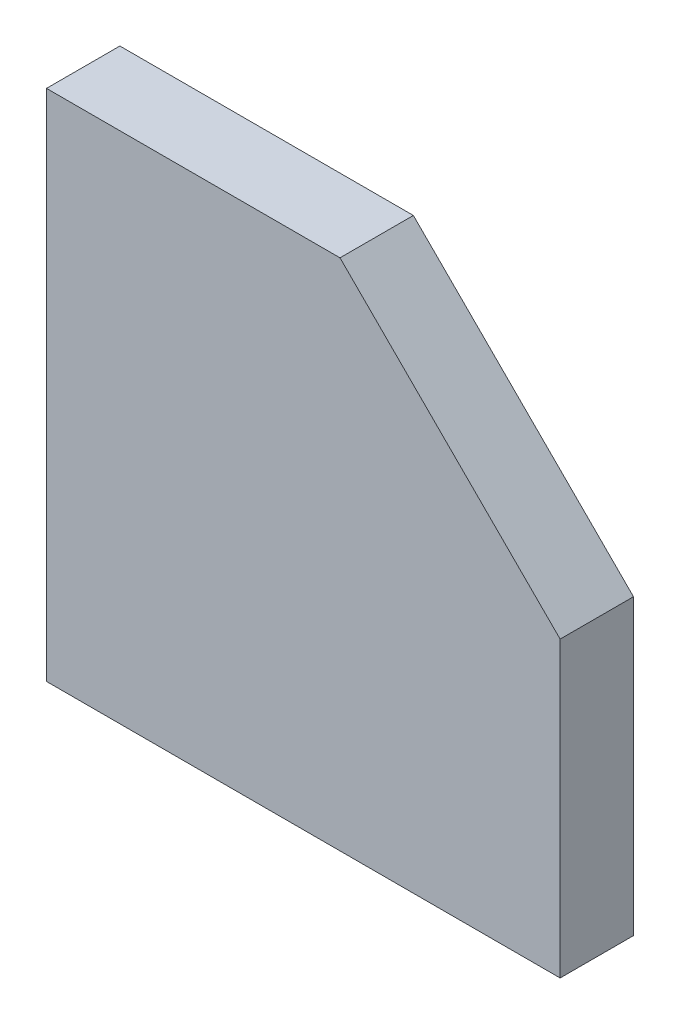
ISO-10303-21;
HEADER;
FILE_DESCRIPTION(('STEP AP214'),'2;1');
FILE_NAME('part.step','',(''),(''),'','','');
FILE_SCHEMA(('AUTOMOTIVE_DESIGN { 1 0 10303 214 1 1 1 1 }'));
ENDSEC;
DATA;
#1=APPLICATION_CONTEXT('core data for automotive mechanical design processes');
#2=APPLICATION_PROTOCOL_DEFINITION('international standard','automotive_design',2000,#1);
#3=PRODUCT_CONTEXT('',#1,'mechanical');
#4=PRODUCT('Part','Part','',(#3));
#5=PRODUCT_RELATED_PRODUCT_CATEGORY('part','',(#4));
#6=PRODUCT_DEFINITION_FORMATION('','',#4);
#7=PRODUCT_DEFINITION_CONTEXT('part definition',#1,'design');
#8=PRODUCT_DEFINITION('design','',#6,#7);
#9=PRODUCT_DEFINITION_SHAPE('','',#8);
#10=(LENGTH_UNIT() NAMED_UNIT(*) SI_UNIT(.MILLI.,.METRE.));
#11=(NAMED_UNIT(*) PLANE_ANGLE_UNIT() SI_UNIT($,.RADIAN.));
#12=(NAMED_UNIT(*) SI_UNIT($,.STERADIAN.) SOLID_ANGLE_UNIT());
#13=UNCERTAINTY_MEASURE_WITH_UNIT(LENGTH_MEASURE(1.E-05),#10,'distance_accuracy_value','');
#14=(GEOMETRIC_REPRESENTATION_CONTEXT(3) GLOBAL_UNCERTAINTY_ASSIGNED_CONTEXT((#13)) GLOBAL_UNIT_ASSIGNED_CONTEXT((#10,
#11,#12)) REPRESENTATION_CONTEXT('',''));
#15=CARTESIAN_POINT('',(0.,0.,0.));
#16=DIRECTION('',(0.,0.,1.));
#17=DIRECTION('',(1.,0.,0.));
#18=AXIS2_PLACEMENT_3D('',#15,#16,#17);
#19=CARTESIAN_POINT('',(0.,0.,10.));
#20=DIRECTION('',(1.,0.,0.));
#21=DIRECTION('',(0.,0.,-1.));
#22=AXIS2_PLACEMENT_3D('',#19,#20,#21);
#23=PLANE('',#22);
#24=DIRECTION('',(0.,-1.,0.));
#25=VECTOR('',#24,1.);
#26=CARTESIAN_POINT('',(0.,0.,0.));
#27=LINE('',#26,#25);
#28=CARTESIAN_POINT('',(0.,70.,0.));
#29=VERTEX_POINT('',#28);
#30=CARTESIAN_POINT('',(0.,0.,0.));
#31=VERTEX_POINT('',#30);
#32=EDGE_CURVE('E109',#29,#31,#27,.T.);
#33=ORIENTED_EDGE('',*,*,#32,.T.);
#34=DIRECTION('',(0.,0.,-1.));
#35=VECTOR('',#34,1.);
#36=CARTESIAN_POINT('',(0.,0.,10.));
#37=LINE('',#36,#35);
#38=CARTESIAN_POINT('',(0.,0.,10.));
#39=VERTEX_POINT('',#38);
#40=EDGE_CURVE('E11',#39,#31,#37,.T.);
#41=ORIENTED_EDGE('',*,*,#40,.F.);
#42=DIRECTION('',(0.,-1.,0.));
#43=VECTOR('',#42,1.);
#44=CARTESIAN_POINT('',(0.,0.,10.));
#45=LINE('',#44,#43);
#46=CARTESIAN_POINT('',(0.,70.,10.));
#47=VERTEX_POINT('',#46);
#48=EDGE_CURVE('E117',#47,#39,#45,.T.);
#49=ORIENTED_EDGE('',*,*,#48,.F.);
#50=DIRECTION('',(0.,0.,-1.));
#51=VECTOR('',#50,1.);
#52=CARTESIAN_POINT('',(0.,70.,10.));
#53=LINE('',#52,#51);
#54=EDGE_CURVE('E105',#47,#29,#53,.T.);
#55=ORIENTED_EDGE('',*,*,#54,.T.);
#56=EDGE_LOOP('',(#33,#41,#49,#55));
#57=FACE_BOUND('',#56,.T.);
#58=ADVANCED_FACE('F35',(#57),#23,.F.);
#59=CARTESIAN_POINT('',(0.,0.,10.));
#60=DIRECTION('',(0.,1.,0.));
#61=DIRECTION('',(0.,0.,1.));
#62=AXIS2_PLACEMENT_3D('',#59,#60,#61);
#63=PLANE('',#62);
#64=DIRECTION('',(1.,0.,0.));
#65=VECTOR('',#64,1.);
#66=CARTESIAN_POINT('',(0.,0.,0.));
#67=LINE('',#66,#65);
#68=CARTESIAN_POINT('',(70.,0.,0.));
#69=VERTEX_POINT('',#68);
#70=EDGE_CURVE('E112',#31,#69,#67,.T.);
#71=ORIENTED_EDGE('',*,*,#70,.T.);
#72=DIRECTION('',(0.,0.,-1.));
#73=VECTOR('',#72,1.);
#74=CARTESIAN_POINT('',(70.,0.,10.));
#75=LINE('',#74,#73);
#76=CARTESIAN_POINT('',(70.,0.,10.));
#77=VERTEX_POINT('',#76);
#78=EDGE_CURVE('E43',#77,#69,#75,.T.);
#79=ORIENTED_EDGE('',*,*,#78,.F.);
#80=DIRECTION('',(1.,0.,0.));
#81=VECTOR('',#80,1.);
#82=CARTESIAN_POINT('',(0.,0.,10.));
#83=LINE('',#82,#81);
#84=EDGE_CURVE('E85',#39,#77,#83,.T.);
#85=ORIENTED_EDGE('',*,*,#84,.F.);
#86=ORIENTED_EDGE('',*,*,#40,.T.);
#87=EDGE_LOOP('',(#71,#79,#85,#86));
#88=FACE_BOUND('',#87,.T.);
#89=ADVANCED_FACE('F136',(#88),#63,.F.);
#90=CARTESIAN_POINT('',(70.,0.,10.));
#91=DIRECTION('',(-1.,0.,0.));
#92=DIRECTION('',(0.,0.,1.));
#93=AXIS2_PLACEMENT_3D('',#90,#91,#92);
#94=PLANE('',#93);
#95=DIRECTION('',(0.,1.,0.));
#96=VECTOR('',#95,1.);
#97=CARTESIAN_POINT('',(70.,0.,0.));
#98=LINE('',#97,#96);
#99=CARTESIAN_POINT('',(70.,40.,0.));
#100=VERTEX_POINT('',#99);
#101=EDGE_CURVE('E100',#69,#100,#98,.T.);
#102=ORIENTED_EDGE('',*,*,#101,.T.);
#103=DIRECTION('',(0.,0.,-1.));
#104=VECTOR('',#103,1.);
#105=CARTESIAN_POINT('',(70.,40.,10.));
#106=LINE('',#105,#104);
#107=CARTESIAN_POINT('',(70.,40.,10.));
#108=VERTEX_POINT('',#107);
#109=EDGE_CURVE('E97',#108,#100,#106,.T.);
#110=ORIENTED_EDGE('',*,*,#109,.F.);
#111=DIRECTION('',(0.,1.,0.));
#112=VECTOR('',#111,1.);
#113=CARTESIAN_POINT('',(70.,0.,10.));
#114=LINE('',#113,#112);
#115=EDGE_CURVE('E89',#77,#108,#114,.T.);
#116=ORIENTED_EDGE('',*,*,#115,.F.);
#117=ORIENTED_EDGE('',*,*,#78,.T.);
#118=EDGE_LOOP('',(#102,#110,#116,#117));
#119=FACE_BOUND('',#118,.T.);
#120=ADVANCED_FACE('F98',(#119),#94,.F.);
#121=CARTESIAN_POINT('',(40.,70.,10.));
#122=DIRECTION('',(-0.707106781186548,-0.707106781186548,0.));
#123=DIRECTION('',(0.707106781186548,-0.707106781186548,0.));
#124=AXIS2_PLACEMENT_3D('',#121,#122,#123);
#125=PLANE('',#124);
#126=DIRECTION('',(-0.707106781186547,0.707106781186547,0.));
#127=VECTOR('',#126,1.);
#128=CARTESIAN_POINT('',(40.,70.,0.));
#129=LINE('',#128,#127);
#130=CARTESIAN_POINT('',(40.,70.,0.));
#131=VERTEX_POINT('',#130);
#132=EDGE_CURVE('E71',#100,#131,#129,.T.);
#133=ORIENTED_EDGE('',*,*,#132,.T.);
#134=DIRECTION('',(0.,0.,-1.));
#135=VECTOR('',#134,1.);
#136=CARTESIAN_POINT('',(40.,70.,10.));
#137=LINE('',#136,#135);
#138=CARTESIAN_POINT('',(40.,70.,10.));
#139=VERTEX_POINT('',#138);
#140=EDGE_CURVE('E101',#139,#131,#137,.T.);
#141=ORIENTED_EDGE('',*,*,#140,.F.);
#142=DIRECTION('',(-0.707106781186547,0.707106781186547,0.));
#143=VECTOR('',#142,1.);
#144=CARTESIAN_POINT('',(40.,70.,10.));
#145=LINE('',#144,#143);
#146=EDGE_CURVE('E93',#108,#139,#145,.T.);
#147=ORIENTED_EDGE('',*,*,#146,.F.);
#148=ORIENTED_EDGE('',*,*,#109,.T.);
#149=EDGE_LOOP('',(#133,#141,#147,#148));
#150=FACE_BOUND('',#149,.T.);
#151=ADVANCED_FACE('F103',(#150),#125,.F.);
#152=CARTESIAN_POINT('',(0.,70.,10.));
#153=DIRECTION('',(0.,-1.,0.));
#154=DIRECTION('',(0.,0.,-1.));
#155=AXIS2_PLACEMENT_3D('',#152,#153,#154);
#156=PLANE('',#155);
#157=DIRECTION('',(-1.,0.,0.));
#158=VECTOR('',#157,1.);
#159=CARTESIAN_POINT('',(0.,70.,0.));
#160=LINE('',#159,#158);
#161=EDGE_CURVE('E77',#131,#29,#160,.T.);
#162=ORIENTED_EDGE('',*,*,#161,.T.);
#163=ORIENTED_EDGE('',*,*,#54,.F.);
#164=DIRECTION('',(-1.,0.,0.));
#165=VECTOR('',#164,1.);
#166=CARTESIAN_POINT('',(0.,70.,10.));
#167=LINE('',#166,#165);
#168=EDGE_CURVE('E51',#139,#47,#167,.T.);
#169=ORIENTED_EDGE('',*,*,#168,.F.);
#170=ORIENTED_EDGE('',*,*,#140,.T.);
#171=EDGE_LOOP('',(#162,#163,#169,#170));
#172=FACE_BOUND('',#171,.T.);
#173=ADVANCED_FACE('F125',(#172),#156,.F.);
#174=CARTESIAN_POINT('',(0.,70.,10.));
#175=DIRECTION('',(0.,0.,-1.));
#176=DIRECTION('',(-1.,0.,0.));
#177=AXIS2_PLACEMENT_3D('',#174,#175,#176);
#178=PLANE('',#177);
#179=ORIENTED_EDGE('',*,*,#48,.T.);
#180=ORIENTED_EDGE('',*,*,#84,.T.);
#181=ORIENTED_EDGE('',*,*,#115,.T.);
#182=ORIENTED_EDGE('',*,*,#146,.T.);
#183=ORIENTED_EDGE('',*,*,#168,.T.);
#184=EDGE_LOOP('',(#179,#180,#181,#182,#183));
#185=FACE_BOUND('',#184,.T.);
#186=ADVANCED_FACE('F91',(#185),#178,.F.);
#187=CARTESIAN_POINT('',(0.,70.,0.));
#188=DIRECTION('',(0.,0.,-1.));
#189=DIRECTION('',(-1.,0.,0.));
#190=AXIS2_PLACEMENT_3D('',#187,#188,#189);
#191=PLANE('',#190);
#192=ORIENTED_EDGE('',*,*,#32,.F.);
#193=ORIENTED_EDGE('',*,*,#161,.F.);
#194=ORIENTED_EDGE('',*,*,#132,.F.);
#195=ORIENTED_EDGE('',*,*,#101,.F.);
#196=ORIENTED_EDGE('',*,*,#70,.F.);
#197=EDGE_LOOP('',(#192,#193,#194,#195,#196));
#198=FACE_BOUND('',#197,.T.);
#199=ADVANCED_FACE('F121',(#198),#191,.T.);
#200=CLOSED_SHELL('',(#58,#89,#120,#151,#173,#186,#199));
#201=MANIFOLD_SOLID_BREP('B2',#200);
#202=ADVANCED_BREP_SHAPE_REPRESENTATION('',(#18,#201),#14);
#203=SHAPE_DEFINITION_REPRESENTATION(#9,#202);
ENDSEC;
END-ISO-10303-21;
